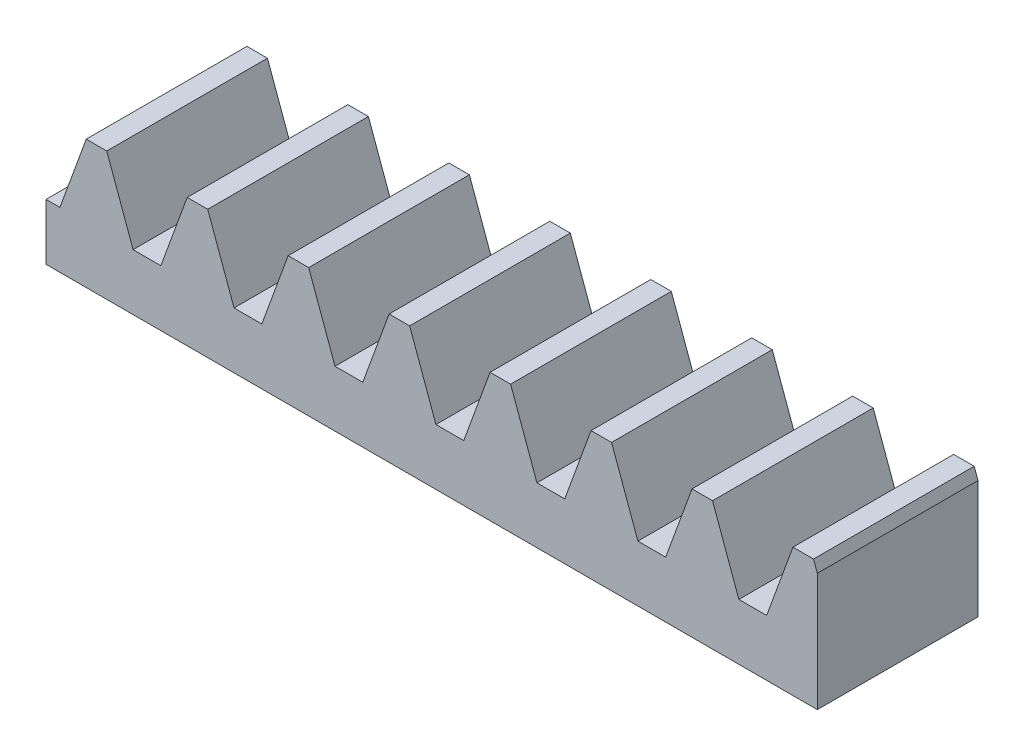
ISO-10303-21;
HEADER;
FILE_DESCRIPTION(('STEP AP214'),'2;1');
FILE_NAME('part.step','',(''),(''),'','','');
FILE_SCHEMA(('AUTOMOTIVE_DESIGN { 1 0 10303 214 1 1 1 1 }'));
ENDSEC;
DATA;
#1=APPLICATION_CONTEXT('core data for automotive mechanical design processes');
#2=APPLICATION_PROTOCOL_DEFINITION('international standard','automotive_design',2000,#1);
#3=PRODUCT_CONTEXT('',#1,'mechanical');
#4=PRODUCT('Part','Part','',(#3));
#5=PRODUCT_RELATED_PRODUCT_CATEGORY('part','',(#4));
#6=PRODUCT_DEFINITION_FORMATION('','',#4);
#7=PRODUCT_DEFINITION_CONTEXT('part definition',#1,'design');
#8=PRODUCT_DEFINITION('design','',#6,#7);
#9=PRODUCT_DEFINITION_SHAPE('','',#8);
#10=(LENGTH_UNIT() NAMED_UNIT(*) SI_UNIT(.MILLI.,.METRE.));
#11=(NAMED_UNIT(*) PLANE_ANGLE_UNIT() SI_UNIT($,.RADIAN.));
#12=(NAMED_UNIT(*) SI_UNIT($,.STERADIAN.) SOLID_ANGLE_UNIT());
#13=UNCERTAINTY_MEASURE_WITH_UNIT(LENGTH_MEASURE(1.E-05),#10,'distance_accuracy_value','');
#14=(GEOMETRIC_REPRESENTATION_CONTEXT(3) GLOBAL_UNCERTAINTY_ASSIGNED_CONTEXT((#13)) GLOBAL_UNIT_ASSIGNED_CONTEXT((#10,
#11,#12)) REPRESENTATION_CONTEXT('',''));
#15=CARTESIAN_POINT('',(0.,0.,0.));
#16=DIRECTION('',(0.,0.,1.));
#17=DIRECTION('',(1.,0.,0.));
#18=AXIS2_PLACEMENT_3D('',#15,#16,#17);
#19=CARTESIAN_POINT('',(0.,50.8,-63.5));
#20=DIRECTION('',(0.,1.,0.));
#21=DIRECTION('',(-1.,0.,0.));
#22=AXIS2_PLACEMENT_3D('',#19,#20,#21);
#23=PLANE('',#22);
#24=DIRECTION('',(0.,0.,1.));
#25=VECTOR('',#24,1.);
#26=CARTESIAN_POINT('',(263.395207946069,50.8,-63.5));
#27=LINE('',#26,#25);
#28=CARTESIAN_POINT('',(263.395207946069,50.8,-63.5));
#29=VERTEX_POINT('',#28);
#30=CARTESIAN_POINT('',(263.395207946069,50.8,0.));
#31=VERTEX_POINT('',#30);
#32=EDGE_CURVE('E325',#29,#31,#27,.T.);
#33=ORIENTED_EDGE('',*,*,#32,.F.);
#34=DIRECTION('',(-1.,0.,0.));
#35=VECTOR('',#34,1.);
#36=CARTESIAN_POINT('',(0.,50.8,-63.5));
#37=LINE('',#36,#35);
#38=CARTESIAN_POINT('',(255.281738568931,50.8,-63.5));
#39=VERTEX_POINT('',#38);
#40=EDGE_CURVE('E399',#29,#39,#37,.T.);
#41=ORIENTED_EDGE('',*,*,#40,.T.);
#42=DIRECTION('',(0.,0.,-1.));
#43=VECTOR('',#42,1.);
#44=CARTESIAN_POINT('',(255.281738568931,50.8,-63.5));
#45=LINE('',#44,#43);
#46=CARTESIAN_POINT('',(255.281738568931,50.8,0.));
#47=VERTEX_POINT('',#46);
#48=EDGE_CURVE('E328',#47,#39,#45,.T.);
#49=ORIENTED_EDGE('',*,*,#48,.F.);
#50=DIRECTION('',(-1.,0.,0.));
#51=VECTOR('',#50,1.);
#52=CARTESIAN_POINT('',(0.,50.8,0.));
#53=LINE('',#52,#51);
#54=EDGE_CURVE('E287',#31,#47,#53,.T.);
#55=ORIENTED_EDGE('',*,*,#54,.F.);
#56=EDGE_LOOP('',(#33,#41,#49,#55));
#57=FACE_BOUND('',#56,.T.);
#58=ADVANCED_FACE('F33',(#57),#23,.T.);
#59=DIRECTION('',(0.,0.,1.));
#60=VECTOR('',#59,1.);
#61=CARTESIAN_POINT('',(223.496981291069,50.8,-63.5));
#62=LINE('',#61,#60);
#63=CARTESIAN_POINT('',(223.496981291069,50.8,-63.5));
#64=VERTEX_POINT('',#63);
#65=CARTESIAN_POINT('',(223.496981291069,50.8,0.));
#66=VERTEX_POINT('',#65);
#67=EDGE_CURVE('E454',#64,#66,#62,.T.);
#68=ORIENTED_EDGE('',*,*,#67,.F.);
#69=CARTESIAN_POINT('',(215.383511913931,50.8,-63.5));
#70=VERTEX_POINT('',#69);
#71=EDGE_CURVE('E624',#64,#70,#37,.T.);
#72=ORIENTED_EDGE('',*,*,#71,.T.);
#73=DIRECTION('',(0.,0.,-1.));
#74=VECTOR('',#73,1.);
#75=CARTESIAN_POINT('',(215.383511913931,50.8,-63.5));
#76=LINE('',#75,#74);
#77=CARTESIAN_POINT('',(215.383511913931,50.8,0.));
#78=VERTEX_POINT('',#77);
#79=EDGE_CURVE('E473',#78,#70,#76,.T.);
#80=ORIENTED_EDGE('',*,*,#79,.F.);
#81=EDGE_CURVE('E329',#66,#78,#53,.T.);
#82=ORIENTED_EDGE('',*,*,#81,.F.);
#83=EDGE_LOOP('',(#68,#72,#80,#82));
#84=FACE_BOUND('',#83,.T.);
#85=ADVANCED_FACE('F582',(#84),#23,.T.);
#86=DIRECTION('',(0.,0.,1.));
#87=VECTOR('',#86,1.);
#88=CARTESIAN_POINT('',(183.598754636069,50.8,-63.5));
#89=LINE('',#88,#87);
#90=CARTESIAN_POINT('',(183.598754636069,50.8,-63.5));
#91=VERTEX_POINT('',#90);
#92=CARTESIAN_POINT('',(183.598754636069,50.8,0.));
#93=VERTEX_POINT('',#92);
#94=EDGE_CURVE('E477',#91,#93,#89,.T.);
#95=ORIENTED_EDGE('',*,*,#94,.F.);
#96=CARTESIAN_POINT('',(175.485285258931,50.8,-63.5));
#97=VERTEX_POINT('',#96);
#98=EDGE_CURVE('E620',#91,#97,#37,.T.);
#99=ORIENTED_EDGE('',*,*,#98,.T.);
#100=DIRECTION('',(0.,0.,-1.));
#101=VECTOR('',#100,1.);
#102=CARTESIAN_POINT('',(175.485285258931,50.8,-63.5));
#103=LINE('',#102,#101);
#104=CARTESIAN_POINT('',(175.485285258931,50.8,0.));
#105=VERTEX_POINT('',#104);
#106=EDGE_CURVE('E496',#105,#97,#103,.T.);
#107=ORIENTED_EDGE('',*,*,#106,.F.);
#108=EDGE_CURVE('E330',#93,#105,#53,.T.);
#109=ORIENTED_EDGE('',*,*,#108,.F.);
#110=EDGE_LOOP('',(#95,#99,#107,#109));
#111=FACE_BOUND('',#110,.T.);
#112=ADVANCED_FACE('F588',(#111),#23,.T.);
#113=DIRECTION('',(0.,0.,1.));
#114=VECTOR('',#113,1.);
#115=CARTESIAN_POINT('',(143.700527981069,50.8,-63.5));
#116=LINE('',#115,#114);
#117=CARTESIAN_POINT('',(143.700527981069,50.8,-63.5));
#118=VERTEX_POINT('',#117);
#119=CARTESIAN_POINT('',(143.700527981069,50.8,0.));
#120=VERTEX_POINT('',#119);
#121=EDGE_CURVE('E500',#118,#120,#116,.T.);
#122=ORIENTED_EDGE('',*,*,#121,.F.);
#123=CARTESIAN_POINT('',(135.587058603931,50.8,-63.5));
#124=VERTEX_POINT('',#123);
#125=EDGE_CURVE('E619',#118,#124,#37,.T.);
#126=ORIENTED_EDGE('',*,*,#125,.T.);
#127=DIRECTION('',(0.,0.,-1.));
#128=VECTOR('',#127,1.);
#129=CARTESIAN_POINT('',(135.587058603931,50.8,-63.5));
#130=LINE('',#129,#128);
#131=CARTESIAN_POINT('',(135.587058603931,50.8,0.));
#132=VERTEX_POINT('',#131);
#133=EDGE_CURVE('E519',#132,#124,#130,.T.);
#134=ORIENTED_EDGE('',*,*,#133,.F.);
#135=EDGE_CURVE('E334',#120,#132,#53,.T.);
#136=ORIENTED_EDGE('',*,*,#135,.F.);
#137=EDGE_LOOP('',(#122,#126,#134,#136));
#138=FACE_BOUND('',#137,.T.);
#139=ADVANCED_FACE('F606',(#138),#23,.T.);
#140=DIRECTION('',(0.,0.,1.));
#141=VECTOR('',#140,1.);
#142=CARTESIAN_POINT('',(103.802301326069,50.8,-63.5));
#143=LINE('',#142,#141);
#144=CARTESIAN_POINT('',(103.802301326069,50.8,-63.5));
#145=VERTEX_POINT('',#144);
#146=CARTESIAN_POINT('',(103.802301326069,50.8,0.));
#147=VERTEX_POINT('',#146);
#148=EDGE_CURVE('E523',#145,#147,#143,.T.);
#149=ORIENTED_EDGE('',*,*,#148,.F.);
#150=CARTESIAN_POINT('',(95.6888319489307,50.8,-63.5));
#151=VERTEX_POINT('',#150);
#152=EDGE_CURVE('E615',#145,#151,#37,.T.);
#153=ORIENTED_EDGE('',*,*,#152,.T.);
#154=DIRECTION('',(0.,0.,-1.));
#155=VECTOR('',#154,1.);
#156=CARTESIAN_POINT('',(95.6888319489307,50.8,-63.5));
#157=LINE('',#156,#155);
#158=CARTESIAN_POINT('',(95.6888319489307,50.8,0.));
#159=VERTEX_POINT('',#158);
#160=EDGE_CURVE('E542',#159,#151,#157,.T.);
#161=ORIENTED_EDGE('',*,*,#160,.F.);
#162=EDGE_CURVE('E338',#147,#159,#53,.T.);
#163=ORIENTED_EDGE('',*,*,#162,.F.);
#164=EDGE_LOOP('',(#149,#153,#161,#163));
#165=FACE_BOUND('',#164,.T.);
#166=ADVANCED_FACE('F602',(#165),#23,.T.);
#167=DIRECTION('',(0.,0.,1.));
#168=VECTOR('',#167,1.);
#169=CARTESIAN_POINT('',(63.9040746710693,50.8,-63.5));
#170=LINE('',#169,#168);
#171=CARTESIAN_POINT('',(63.9040746710693,50.8,-63.5));
#172=VERTEX_POINT('',#171);
#173=CARTESIAN_POINT('',(63.9040746710693,50.8,0.));
#174=VERTEX_POINT('',#173);
#175=EDGE_CURVE('E546',#172,#174,#170,.T.);
#176=ORIENTED_EDGE('',*,*,#175,.F.);
#177=CARTESIAN_POINT('',(55.7906052939307,50.8,-63.5));
#178=VERTEX_POINT('',#177);
#179=EDGE_CURVE('E368',#172,#178,#37,.T.);
#180=ORIENTED_EDGE('',*,*,#179,.T.);
#181=DIRECTION('',(0.,0.,-1.));
#182=VECTOR('',#181,1.);
#183=CARTESIAN_POINT('',(55.7906052939307,50.8,-63.5));
#184=LINE('',#183,#182);
#185=CARTESIAN_POINT('',(55.7906052939307,50.8,0.));
#186=VERTEX_POINT('',#185);
#187=EDGE_CURVE('E359',#186,#178,#184,.T.);
#188=ORIENTED_EDGE('',*,*,#187,.F.);
#189=EDGE_CURVE('E279',#174,#186,#53,.T.);
#190=ORIENTED_EDGE('',*,*,#189,.F.);
#191=EDGE_LOOP('',(#176,#180,#188,#190));
#192=FACE_BOUND('',#191,.T.);
#193=ADVANCED_FACE('F366',(#192),#23,.T.);
#194=DIRECTION('',(0.,0.,1.));
#195=VECTOR('',#194,1.);
#196=CARTESIAN_POINT('',(24.0058480160693,50.8,-63.5));
#197=LINE('',#196,#195);
#198=CARTESIAN_POINT('',(24.0058480160693,50.8,-63.5));
#199=VERTEX_POINT('',#198);
#200=CARTESIAN_POINT('',(24.0058480160693,50.8,0.));
#201=VERTEX_POINT('',#200);
#202=EDGE_CURVE('E369',#199,#201,#197,.T.);
#203=ORIENTED_EDGE('',*,*,#202,.F.);
#204=CARTESIAN_POINT('',(15.8923786389307,50.8,-63.5));
#205=VERTEX_POINT('',#204);
#206=EDGE_CURVE('E398',#199,#205,#37,.T.);
#207=ORIENTED_EDGE('',*,*,#206,.T.);
#208=DIRECTION('',(0.,0.,-1.));
#209=VECTOR('',#208,1.);
#210=CARTESIAN_POINT('',(15.8923786389307,50.8,-63.5));
#211=LINE('',#210,#209);
#212=CARTESIAN_POINT('',(15.8923786389307,50.8,0.));
#213=VERTEX_POINT('',#212);
#214=EDGE_CURVE('E390',#213,#205,#211,.T.);
#215=ORIENTED_EDGE('',*,*,#214,.F.);
#216=EDGE_CURVE('E277',#201,#213,#53,.T.);
#217=ORIENTED_EDGE('',*,*,#216,.F.);
#218=EDGE_LOOP('',(#203,#207,#215,#217));
#219=FACE_BOUND('',#218,.T.);
#220=ADVANCED_FACE('F564',(#219),#23,.T.);
#221=CARTESIAN_POINT('',(0.,0.,-63.5));
#222=DIRECTION('',(-1.,0.,0.));
#223=DIRECTION('',(0.,0.,1.));
#224=AXIS2_PLACEMENT_3D('',#221,#222,#223);
#225=PLANE('',#224);
#226=DIRECTION('',(0.,0.,1.));
#227=VECTOR('',#226,1.);
#228=CARTESIAN_POINT('',(0.,22.225,-63.5));
#229=LINE('',#228,#227);
#230=CARTESIAN_POINT('',(0.,22.225,-63.5));
#231=VERTEX_POINT('',#230);
#232=CARTESIAN_POINT('',(0.,22.225,0.));
#233=VERTEX_POINT('',#232);
#234=EDGE_CURVE('E388',#231,#233,#229,.T.);
#235=ORIENTED_EDGE('',*,*,#234,.F.);
#236=DIRECTION('',(0.,-1.,0.));
#237=VECTOR('',#236,1.);
#238=CARTESIAN_POINT('',(0.,0.,-63.5));
#239=LINE('',#238,#237);
#240=CARTESIAN_POINT('',(0.,0.,-63.5));
#241=VERTEX_POINT('',#240);
#242=EDGE_CURVE('E286',#231,#241,#239,.T.);
#243=ORIENTED_EDGE('',*,*,#242,.T.);
#244=DIRECTION('',(0.,0.,1.));
#245=VECTOR('',#244,1.);
#246=CARTESIAN_POINT('',(0.,0.,-63.5));
#247=LINE('',#246,#245);
#248=CARTESIAN_POINT('',(0.,0.,0.));
#249=VERTEX_POINT('',#248);
#250=EDGE_CURVE('E291',#241,#249,#247,.T.);
#251=ORIENTED_EDGE('',*,*,#250,.T.);
#252=DIRECTION('',(0.,-1.,0.));
#253=VECTOR('',#252,1.);
#254=CARTESIAN_POINT('',(0.,0.,0.));
#255=LINE('',#254,#253);
#256=EDGE_CURVE('E282',#233,#249,#255,.T.);
#257=ORIENTED_EDGE('',*,*,#256,.F.);
#258=EDGE_LOOP('',(#235,#243,#251,#257));
#259=FACE_BOUND('',#258,.T.);
#260=ADVANCED_FACE('F35',(#259),#225,.T.);
#261=DIRECTION('',(0.,0.,1.));
#262=VECTOR('',#261,1.);
#263=CARTESIAN_POINT('',(303.293434601069,50.8,-63.5));
#264=LINE('',#263,#262);
#265=CARTESIAN_POINT('',(303.293434601069,50.8,-63.5));
#266=VERTEX_POINT('',#265);
#267=CARTESIAN_POINT('',(303.293434601069,50.8,0.));
#268=VERTEX_POINT('',#267);
#269=EDGE_CURVE('E48',#266,#268,#264,.T.);
#270=ORIENTED_EDGE('',*,*,#269,.F.);
#271=CARTESIAN_POINT('',(295.179965223931,50.8,-63.5));
#272=VERTEX_POINT('',#271);
#273=EDGE_CURVE('E294',#266,#272,#37,.T.);
#274=ORIENTED_EDGE('',*,*,#273,.T.);
#275=DIRECTION('',(0.,0.,-1.));
#276=VECTOR('',#275,1.);
#277=CARTESIAN_POINT('',(295.179965223931,50.8,-63.5));
#278=LINE('',#277,#276);
#279=CARTESIAN_POINT('',(295.179965223931,50.8,0.));
#280=VERTEX_POINT('',#279);
#281=EDGE_CURVE('E430',#280,#272,#278,.T.);
#282=ORIENTED_EDGE('',*,*,#281,.F.);
#283=EDGE_CURVE('E281',#268,#280,#53,.T.);
#284=ORIENTED_EDGE('',*,*,#283,.F.);
#285=EDGE_LOOP('',(#270,#274,#282,#284));
#286=FACE_BOUND('',#285,.T.);
#287=ADVANCED_FACE('F584',(#286),#23,.T.);
#288=CARTESIAN_POINT('',(304.8,0.,-63.5));
#289=DIRECTION('',(1.,0.,0.));
#290=DIRECTION('',(0.,0.,-1.));
#291=AXIS2_PLACEMENT_3D('',#288,#289,#290);
#292=PLANE('',#291);
#293=DIRECTION('',(0.,0.,-1.));
#294=VECTOR('',#293,1.);
#295=CARTESIAN_POINT('',(304.8,46.6607455855063,-63.5));
#296=LINE('',#295,#294);
#297=CARTESIAN_POINT('',(304.8,46.6607455855065,0.));
#298=VERTEX_POINT('',#297);
#299=CARTESIAN_POINT('',(304.8,46.6607455855065,-63.5));
#300=VERTEX_POINT('',#299);
#301=EDGE_CURVE('E259',#298,#300,#296,.T.);
#302=ORIENTED_EDGE('',*,*,#301,.F.);
#303=DIRECTION('',(0.,1.,0.));
#304=VECTOR('',#303,1.);
#305=CARTESIAN_POINT('',(304.8,0.,0.));
#306=LINE('',#305,#304);
#307=CARTESIAN_POINT('',(304.8,0.,0.));
#308=VERTEX_POINT('',#307);
#309=EDGE_CURVE('E268',#308,#298,#306,.T.);
#310=ORIENTED_EDGE('',*,*,#309,.F.);
#311=DIRECTION('',(0.,0.,1.));
#312=VECTOR('',#311,1.);
#313=CARTESIAN_POINT('',(304.8,0.,-63.5));
#314=LINE('',#313,#312);
#315=CARTESIAN_POINT('',(304.8,0.,-63.5));
#316=VERTEX_POINT('',#315);
#317=EDGE_CURVE('E288',#316,#308,#314,.T.);
#318=ORIENTED_EDGE('',*,*,#317,.F.);
#319=DIRECTION('',(0.,1.,0.));
#320=VECTOR('',#319,1.);
#321=CARTESIAN_POINT('',(304.8,0.,-63.5));
#322=LINE('',#321,#320);
#323=EDGE_CURVE('E271',#316,#300,#322,.T.);
#324=ORIENTED_EDGE('',*,*,#323,.T.);
#325=EDGE_LOOP('',(#302,#310,#318,#324));
#326=FACE_BOUND('',#325,.T.);
#327=ADVANCED_FACE('F267',(#326),#292,.T.);
#328=CARTESIAN_POINT('',(0.,0.,-63.5));
#329=DIRECTION('',(0.,-1.,0.));
#330=DIRECTION('',(0.,0.,-1.));
#331=AXIS2_PLACEMENT_3D('',#328,#329,#330);
#332=PLANE('',#331);
#333=DIRECTION('',(1.,0.,0.));
#334=VECTOR('',#333,1.);
#335=CARTESIAN_POINT('',(0.,0.,0.));
#336=LINE('',#335,#334);
#337=EDGE_CURVE('E276',#249,#308,#336,.T.);
#338=ORIENTED_EDGE('',*,*,#337,.F.);
#339=ORIENTED_EDGE('',*,*,#250,.F.);
#340=DIRECTION('',(1.,0.,0.));
#341=VECTOR('',#340,1.);
#342=CARTESIAN_POINT('',(0.,0.,-63.5));
#343=LINE('',#342,#341);
#344=EDGE_CURVE('E394',#241,#316,#343,.T.);
#345=ORIENTED_EDGE('',*,*,#344,.T.);
#346=ORIENTED_EDGE('',*,*,#317,.T.);
#347=EDGE_LOOP('',(#338,#339,#345,#346));
#348=FACE_BOUND('',#347,.T.);
#349=ADVANCED_FACE('F408',(#348),#332,.T.);
#350=CARTESIAN_POINT('',(0.,0.,-63.5));
#351=DIRECTION('',(0.,0.,-1.));
#352=DIRECTION('',(-1.,0.,0.));
#353=AXIS2_PLACEMENT_3D('',#350,#351,#352);
#354=PLANE('',#353);
#355=DIRECTION('',(0.342020143325663,-0.939692620785911,0.));
#356=VECTOR('',#355,1.);
#357=CARTESIAN_POINT('',(303.284189757119,50.8254,-63.5));
#358=LINE('',#357,#356);
#359=EDGE_CURVE('E272',#266,#300,#358,.T.);
#360=ORIENTED_EDGE('',*,*,#359,.T.);
#361=ORIENTED_EDGE('',*,*,#323,.F.);
#362=ORIENTED_EDGE('',*,*,#344,.F.);
#363=ORIENTED_EDGE('',*,*,#242,.F.);
#364=DIRECTION('',(1.,0.,0.));
#365=VECTOR('',#364,1.);
#366=CARTESIAN_POINT('',(5.49192919477418,22.225,-63.5));
#367=LINE('',#366,#365);
#368=CARTESIAN_POINT('',(5.49192919477418,22.225,-63.5));
#369=VERTEX_POINT('',#368);
#370=EDGE_CURVE('E377',#231,#369,#367,.T.);
#371=ORIENTED_EDGE('',*,*,#370,.T.);
#372=DIRECTION('',(0.342020143325663,0.939692620785911,0.));
#373=VECTOR('',#372,1.);
#374=CARTESIAN_POINT('',(15.9016234828811,50.8254,-63.5));
#375=LINE('',#374,#373);
#376=EDGE_CURVE('E380',#369,#205,#375,.T.);
#377=ORIENTED_EDGE('',*,*,#376,.T.);
#378=ORIENTED_EDGE('',*,*,#206,.F.);
#379=DIRECTION('',(0.342020143325663,-0.939692620785911,0.));
#380=VECTOR('',#379,1.);
#381=CARTESIAN_POINT('',(23.9966031721189,50.8254,-63.5));
#382=LINE('',#381,#380);
#383=CARTESIAN_POINT('',(34.4062974602258,22.225,-63.5));
#384=VERTEX_POINT('',#383);
#385=EDGE_CURVE('E363',#199,#384,#382,.T.);
#386=ORIENTED_EDGE('',*,*,#385,.T.);
#387=DIRECTION('',(1.,0.,0.));
#388=VECTOR('',#387,1.);
#389=CARTESIAN_POINT('',(45.3901558497742,22.225,-63.5));
#390=LINE('',#389,#388);
#391=CARTESIAN_POINT('',(45.3901558497742,22.225,-63.5));
#392=VERTEX_POINT('',#391);
#393=EDGE_CURVE('E550',#384,#392,#390,.T.);
#394=ORIENTED_EDGE('',*,*,#393,.T.);
#395=DIRECTION('',(0.342020143325663,0.939692620785911,0.));
#396=VECTOR('',#395,1.);
#397=CARTESIAN_POINT('',(55.7998501378811,50.8254,-63.5));
#398=LINE('',#397,#396);
#399=EDGE_CURVE('E553',#392,#178,#398,.T.);
#400=ORIENTED_EDGE('',*,*,#399,.T.);
#401=ORIENTED_EDGE('',*,*,#179,.F.);
#402=DIRECTION('',(0.342020143325663,-0.939692620785911,0.));
#403=VECTOR('',#402,1.);
#404=CARTESIAN_POINT('',(63.8948298271189,50.8254,-63.5));
#405=LINE('',#404,#403);
#406=CARTESIAN_POINT('',(74.3045241152258,22.225,-63.5));
#407=VERTEX_POINT('',#406);
#408=EDGE_CURVE('E526',#172,#407,#405,.T.);
#409=ORIENTED_EDGE('',*,*,#408,.T.);
#410=DIRECTION('',(1.,0.,0.));
#411=VECTOR('',#410,1.);
#412=CARTESIAN_POINT('',(85.2883825047742,22.225,-63.5));
#413=LINE('',#412,#411);
#414=CARTESIAN_POINT('',(85.2883825047742,22.225,-63.5));
#415=VERTEX_POINT('',#414);
#416=EDGE_CURVE('E529',#407,#415,#413,.T.);
#417=ORIENTED_EDGE('',*,*,#416,.T.);
#418=DIRECTION('',(0.342020143325663,0.939692620785911,0.));
#419=VECTOR('',#418,1.);
#420=CARTESIAN_POINT('',(95.6980767928811,50.8254,-63.5));
#421=LINE('',#420,#419);
#422=EDGE_CURVE('E533',#415,#151,#421,.T.);
#423=ORIENTED_EDGE('',*,*,#422,.T.);
#424=ORIENTED_EDGE('',*,*,#152,.F.);
#425=DIRECTION('',(0.342020143325663,-0.939692620785911,0.));
#426=VECTOR('',#425,1.);
#427=CARTESIAN_POINT('',(103.793056482119,50.8254,-63.5));
#428=LINE('',#427,#426);
#429=CARTESIAN_POINT('',(114.202750770226,22.225,-63.5));
#430=VERTEX_POINT('',#429);
#431=EDGE_CURVE('E503',#145,#430,#428,.T.);
#432=ORIENTED_EDGE('',*,*,#431,.T.);
#433=DIRECTION('',(1.,0.,0.));
#434=VECTOR('',#433,1.);
#435=CARTESIAN_POINT('',(125.186609159774,22.225,-63.5));
#436=LINE('',#435,#434);
#437=CARTESIAN_POINT('',(125.186609159774,22.225,-63.5));
#438=VERTEX_POINT('',#437);
#439=EDGE_CURVE('E506',#430,#438,#436,.T.);
#440=ORIENTED_EDGE('',*,*,#439,.T.);
#441=DIRECTION('',(0.342020143325663,0.939692620785911,0.));
#442=VECTOR('',#441,1.);
#443=CARTESIAN_POINT('',(135.596303447881,50.8254,-63.5));
#444=LINE('',#443,#442);
#445=EDGE_CURVE('E510',#438,#124,#444,.T.);
#446=ORIENTED_EDGE('',*,*,#445,.T.);
#447=ORIENTED_EDGE('',*,*,#125,.F.);
#448=DIRECTION('',(0.342020143325663,-0.939692620785911,0.));
#449=VECTOR('',#448,1.);
#450=CARTESIAN_POINT('',(143.691283137119,50.8254,-63.5));
#451=LINE('',#450,#449);
#452=CARTESIAN_POINT('',(154.100977425226,22.225,-63.5));
#453=VERTEX_POINT('',#452);
#454=EDGE_CURVE('E480',#118,#453,#451,.T.);
#455=ORIENTED_EDGE('',*,*,#454,.T.);
#456=DIRECTION('',(1.,0.,0.));
#457=VECTOR('',#456,1.);
#458=CARTESIAN_POINT('',(165.084835814774,22.225,-63.5));
#459=LINE('',#458,#457);
#460=CARTESIAN_POINT('',(165.084835814774,22.225,-63.5));
#461=VERTEX_POINT('',#460);
#462=EDGE_CURVE('E483',#453,#461,#459,.T.);
#463=ORIENTED_EDGE('',*,*,#462,.T.);
#464=DIRECTION('',(0.342020143325663,0.939692620785911,0.));
#465=VECTOR('',#464,1.);
#466=CARTESIAN_POINT('',(175.494530102881,50.8254,-63.5));
#467=LINE('',#466,#465);
#468=EDGE_CURVE('E487',#461,#97,#467,.T.);
#469=ORIENTED_EDGE('',*,*,#468,.T.);
#470=ORIENTED_EDGE('',*,*,#98,.F.);
#471=DIRECTION('',(0.342020143325663,-0.939692620785911,0.));
#472=VECTOR('',#471,1.);
#473=CARTESIAN_POINT('',(183.589509792119,50.8254,-63.5));
#474=LINE('',#473,#472);
#475=CARTESIAN_POINT('',(193.999204080226,22.225,-63.5));
#476=VERTEX_POINT('',#475);
#477=EDGE_CURVE('E457',#91,#476,#474,.T.);
#478=ORIENTED_EDGE('',*,*,#477,.T.);
#479=DIRECTION('',(1.,0.,0.));
#480=VECTOR('',#479,1.);
#481=CARTESIAN_POINT('',(204.983062469774,22.225,-63.5));
#482=LINE('',#481,#480);
#483=CARTESIAN_POINT('',(204.983062469774,22.225,-63.5));
#484=VERTEX_POINT('',#483);
#485=EDGE_CURVE('E460',#476,#484,#482,.T.);
#486=ORIENTED_EDGE('',*,*,#485,.T.);
#487=DIRECTION('',(0.342020143325663,0.939692620785911,0.));
#488=VECTOR('',#487,1.);
#489=CARTESIAN_POINT('',(215.392756757881,50.8254,-63.5));
#490=LINE('',#489,#488);
#491=EDGE_CURVE('E464',#484,#70,#490,.T.);
#492=ORIENTED_EDGE('',*,*,#491,.T.);
#493=ORIENTED_EDGE('',*,*,#71,.F.);
#494=DIRECTION('',(0.342020143325663,-0.939692620785911,0.));
#495=VECTOR('',#494,1.);
#496=CARTESIAN_POINT('',(223.487736447119,50.8254,-63.5));
#497=LINE('',#496,#495);
#498=CARTESIAN_POINT('',(233.897430735226,22.225,-63.5));
#499=VERTEX_POINT('',#498);
#500=EDGE_CURVE('E436',#64,#499,#497,.T.);
#501=ORIENTED_EDGE('',*,*,#500,.T.);
#502=DIRECTION('',(1.,0.,0.));
#503=VECTOR('',#502,1.);
#504=CARTESIAN_POINT('',(244.881289124774,22.225,-63.5));
#505=LINE('',#504,#503);
#506=CARTESIAN_POINT('',(244.881289124774,22.225,-63.5));
#507=VERTEX_POINT('',#506);
#508=EDGE_CURVE('E439',#499,#507,#505,.T.);
#509=ORIENTED_EDGE('',*,*,#508,.T.);
#510=DIRECTION('',(0.342020143325663,0.939692620785911,0.));
#511=VECTOR('',#510,1.);
#512=CARTESIAN_POINT('',(255.290983412881,50.8254,-63.5));
#513=LINE('',#512,#511);
#514=EDGE_CURVE('E443',#507,#39,#513,.T.);
#515=ORIENTED_EDGE('',*,*,#514,.T.);
#516=ORIENTED_EDGE('',*,*,#40,.F.);
#517=DIRECTION('',(0.342020143325663,-0.939692620785911,0.));
#518=VECTOR('',#517,1.);
#519=CARTESIAN_POINT('',(263.385963102119,50.8254,-63.5));
#520=LINE('',#519,#518);
#521=CARTESIAN_POINT('',(273.795657390226,22.225,-63.5));
#522=VERTEX_POINT('',#521);
#523=EDGE_CURVE('E416',#29,#522,#520,.T.);
#524=ORIENTED_EDGE('',*,*,#523,.T.);
#525=DIRECTION('',(1.,0.,0.));
#526=VECTOR('',#525,1.);
#527=CARTESIAN_POINT('',(284.779515779774,22.225,-63.5));
#528=LINE('',#527,#526);
#529=CARTESIAN_POINT('',(284.779515779774,22.225,-63.5));
#530=VERTEX_POINT('',#529);
#531=EDGE_CURVE('E419',#522,#530,#528,.T.);
#532=ORIENTED_EDGE('',*,*,#531,.T.);
#533=DIRECTION('',(0.342020143325663,0.939692620785911,0.));
#534=VECTOR('',#533,1.);
#535=CARTESIAN_POINT('',(295.189210067881,50.8254,-63.5));
#536=LINE('',#535,#534);
#537=EDGE_CURVE('E423',#530,#272,#536,.T.);
#538=ORIENTED_EDGE('',*,*,#537,.T.);
#539=ORIENTED_EDGE('',*,*,#273,.F.);
#540=EDGE_LOOP('',(#360,#361,#362,#363,#371,#377,#378,#386,#394,#400,#401,#409,#417,#423,#424,
#432,#440,#446,#447,#455,#463,#469,#470,#478,#486,#492,#493,#501,#509,#515,#516,#524,#532,#538,#539));
#541=FACE_BOUND('',#540,.T.);
#542=ADVANCED_FACE('F410',(#541),#354,.T.);
#543=CARTESIAN_POINT('',(0.,0.,0.));
#544=DIRECTION('',(0.,0.,-1.));
#545=DIRECTION('',(-1.,0.,0.));
#546=AXIS2_PLACEMENT_3D('',#543,#544,#545);
#547=PLANE('',#546);
#548=ORIENTED_EDGE('',*,*,#309,.T.);
#549=DIRECTION('',(-0.342020143325663,0.939692620785911,0.));
#550=VECTOR('',#549,1.);
#551=CARTESIAN_POINT('',(284.141647691883,103.419102075197,0.));
#552=LINE('',#551,#550);
#553=EDGE_CURVE('E11',#298,#268,#552,.T.);
#554=ORIENTED_EDGE('',*,*,#553,.T.);
#555=ORIENTED_EDGE('',*,*,#283,.T.);
#556=DIRECTION('',(0.342020143325663,0.939692620785911,0.));
#557=VECTOR('',#556,1.);
#558=CARTESIAN_POINT('',(295.189210067881,50.8254,0.));
#559=LINE('',#558,#557);
#560=CARTESIAN_POINT('',(284.779515779774,22.225,0.));
#561=VERTEX_POINT('',#560);
#562=EDGE_CURVE('E420',#561,#280,#559,.T.);
#563=ORIENTED_EDGE('',*,*,#562,.F.);
#564=DIRECTION('',(1.,0.,0.));
#565=VECTOR('',#564,1.);
#566=CARTESIAN_POINT('',(284.779515779774,22.225,0.));
#567=LINE('',#566,#565);
#568=CARTESIAN_POINT('',(273.795657390226,22.225,0.));
#569=VERTEX_POINT('',#568);
#570=EDGE_CURVE('E320',#569,#561,#567,.T.);
#571=ORIENTED_EDGE('',*,*,#570,.F.);
#572=DIRECTION('',(-0.342020143325663,0.939692620785911,0.));
#573=VECTOR('',#572,1.);
#574=CARTESIAN_POINT('',(248.910626954701,90.5960592040479,0.));
#575=LINE('',#574,#573);
#576=EDGE_CURVE('E41',#569,#31,#575,.T.);
#577=ORIENTED_EDGE('',*,*,#576,.T.);
#578=ORIENTED_EDGE('',*,*,#54,.T.);
#579=DIRECTION('',(0.342020143325663,0.939692620785911,0.));
#580=VECTOR('',#579,1.);
#581=CARTESIAN_POINT('',(255.290983412881,50.8254,0.));
#582=LINE('',#581,#580);
#583=CARTESIAN_POINT('',(244.881289124774,22.225,0.));
#584=VERTEX_POINT('',#583);
#585=EDGE_CURVE('E440',#584,#47,#582,.T.);
#586=ORIENTED_EDGE('',*,*,#585,.F.);
#587=DIRECTION('',(1.,0.,0.));
#588=VECTOR('',#587,1.);
#589=CARTESIAN_POINT('',(244.881289124774,22.225,0.));
#590=LINE('',#589,#588);
#591=CARTESIAN_POINT('',(233.897430735226,22.225,0.));
#592=VERTEX_POINT('',#591);
#593=EDGE_CURVE('E435',#592,#584,#590,.T.);
#594=ORIENTED_EDGE('',*,*,#593,.F.);
#595=DIRECTION('',(-0.342020143325663,0.939692620785911,0.));
#596=VECTOR('',#595,1.);
#597=CARTESIAN_POINT('',(213.679606217518,77.7730163328985,0.));
#598=LINE('',#597,#596);
#599=EDGE_CURVE('E312',#592,#66,#598,.T.);
#600=ORIENTED_EDGE('',*,*,#599,.T.);
#601=ORIENTED_EDGE('',*,*,#81,.T.);
#602=DIRECTION('',(0.342020143325663,0.939692620785911,0.));
#603=VECTOR('',#602,1.);
#604=CARTESIAN_POINT('',(215.392756757881,50.8254,0.));
#605=LINE('',#604,#603);
#606=CARTESIAN_POINT('',(204.983062469774,22.225,0.));
#607=VERTEX_POINT('',#606);
#608=EDGE_CURVE('E461',#607,#78,#605,.T.);
#609=ORIENTED_EDGE('',*,*,#608,.F.);
#610=DIRECTION('',(1.,0.,0.));
#611=VECTOR('',#610,1.);
#612=CARTESIAN_POINT('',(204.983062469774,22.225,0.));
#613=LINE('',#612,#611);
#614=CARTESIAN_POINT('',(193.999204080226,22.225,0.));
#615=VERTEX_POINT('',#614);
#616=EDGE_CURVE('E456',#615,#607,#613,.T.);
#617=ORIENTED_EDGE('',*,*,#616,.F.);
#618=DIRECTION('',(-0.342020143325663,0.939692620785911,0.));
#619=VECTOR('',#618,1.);
#620=CARTESIAN_POINT('',(178.448585480336,64.9499734617491,0.));
#621=LINE('',#620,#619);
#622=EDGE_CURVE('E309',#615,#93,#621,.T.);
#623=ORIENTED_EDGE('',*,*,#622,.T.);
#624=ORIENTED_EDGE('',*,*,#108,.T.);
#625=DIRECTION('',(0.342020143325663,0.939692620785911,0.));
#626=VECTOR('',#625,1.);
#627=CARTESIAN_POINT('',(175.494530102881,50.8254,0.));
#628=LINE('',#627,#626);
#629=CARTESIAN_POINT('',(165.084835814774,22.225,0.));
#630=VERTEX_POINT('',#629);
#631=EDGE_CURVE('E484',#630,#105,#628,.T.);
#632=ORIENTED_EDGE('',*,*,#631,.F.);
#633=DIRECTION('',(1.,0.,0.));
#634=VECTOR('',#633,1.);
#635=CARTESIAN_POINT('',(165.084835814774,22.225,0.));
#636=LINE('',#635,#634);
#637=CARTESIAN_POINT('',(154.100977425226,22.225,0.));
#638=VERTEX_POINT('',#637);
#639=EDGE_CURVE('E479',#638,#630,#636,.T.);
#640=ORIENTED_EDGE('',*,*,#639,.F.);
#641=DIRECTION('',(-0.342020143325663,0.939692620785911,0.));
#642=VECTOR('',#641,1.);
#643=CARTESIAN_POINT('',(143.217564743154,52.1269305905997,0.));
#644=LINE('',#643,#642);
#645=EDGE_CURVE('E306',#638,#120,#644,.T.);
#646=ORIENTED_EDGE('',*,*,#645,.T.);
#647=ORIENTED_EDGE('',*,*,#135,.T.);
#648=DIRECTION('',(0.342020143325663,0.939692620785911,0.));
#649=VECTOR('',#648,1.);
#650=CARTESIAN_POINT('',(135.596303447881,50.8254,0.));
#651=LINE('',#650,#649);
#652=CARTESIAN_POINT('',(125.186609159774,22.225,0.));
#653=VERTEX_POINT('',#652);
#654=EDGE_CURVE('E507',#653,#132,#651,.T.);
#655=ORIENTED_EDGE('',*,*,#654,.F.);
#656=DIRECTION('',(1.,0.,0.));
#657=VECTOR('',#656,1.);
#658=CARTESIAN_POINT('',(125.186609159774,22.225,0.));
#659=LINE('',#658,#657);
#660=CARTESIAN_POINT('',(114.202750770226,22.225,0.));
#661=VERTEX_POINT('',#660);
#662=EDGE_CURVE('E502',#661,#653,#659,.T.);
#663=ORIENTED_EDGE('',*,*,#662,.F.);
#664=DIRECTION('',(-0.342020143325663,0.939692620785911,0.));
#665=VECTOR('',#664,1.);
#666=CARTESIAN_POINT('',(107.986544005971,39.3038877194502,0.));
#667=LINE('',#666,#665);
#668=EDGE_CURVE('E303',#661,#147,#667,.T.);
#669=ORIENTED_EDGE('',*,*,#668,.T.);
#670=ORIENTED_EDGE('',*,*,#162,.T.);
#671=DIRECTION('',(0.342020143325663,0.939692620785911,0.));
#672=VECTOR('',#671,1.);
#673=CARTESIAN_POINT('',(95.6980767928811,50.8254,0.));
#674=LINE('',#673,#672);
#675=CARTESIAN_POINT('',(85.2883825047742,22.225,0.));
#676=VERTEX_POINT('',#675);
#677=EDGE_CURVE('E530',#676,#159,#674,.T.);
#678=ORIENTED_EDGE('',*,*,#677,.F.);
#679=DIRECTION('',(1.,0.,0.));
#680=VECTOR('',#679,1.);
#681=CARTESIAN_POINT('',(85.2883825047742,22.225,0.));
#682=LINE('',#681,#680);
#683=CARTESIAN_POINT('',(74.3045241152258,22.225,0.));
#684=VERTEX_POINT('',#683);
#685=EDGE_CURVE('E525',#684,#676,#682,.T.);
#686=ORIENTED_EDGE('',*,*,#685,.F.);
#687=DIRECTION('',(-0.342020143325663,0.939692620785911,0.));
#688=VECTOR('',#687,1.);
#689=CARTESIAN_POINT('',(72.7555232687892,26.4808448483008,0.));
#690=LINE('',#689,#688);
#691=EDGE_CURVE('E300',#684,#174,#690,.T.);
#692=ORIENTED_EDGE('',*,*,#691,.T.);
#693=ORIENTED_EDGE('',*,*,#189,.T.);
#694=DIRECTION('',(0.342020143325663,0.939692620785911,0.));
#695=VECTOR('',#694,1.);
#696=CARTESIAN_POINT('',(55.7998501378811,50.8254,0.));
#697=LINE('',#696,#695);
#698=CARTESIAN_POINT('',(45.3901558497742,22.225,0.));
#699=VERTEX_POINT('',#698);
#700=EDGE_CURVE('E349',#699,#186,#697,.T.);
#701=ORIENTED_EDGE('',*,*,#700,.F.);
#702=DIRECTION('',(1.,0.,0.));
#703=VECTOR('',#702,1.);
#704=CARTESIAN_POINT('',(45.3901558497742,22.225,0.));
#705=LINE('',#704,#703);
#706=CARTESIAN_POINT('',(34.4062974602258,22.225,0.));
#707=VERTEX_POINT('',#706);
#708=EDGE_CURVE('E364',#707,#699,#705,.T.);
#709=ORIENTED_EDGE('',*,*,#708,.F.);
#710=DIRECTION('',(-0.342020143325663,0.939692620785911,0.));
#711=VECTOR('',#710,1.);
#712=CARTESIAN_POINT('',(37.5245025316069,13.6578019771514,0.));
#713=LINE('',#712,#711);
#714=EDGE_CURVE('E297',#707,#201,#713,.T.);
#715=ORIENTED_EDGE('',*,*,#714,.T.);
#716=ORIENTED_EDGE('',*,*,#216,.T.);
#717=DIRECTION('',(0.342020143325663,0.939692620785911,0.));
#718=VECTOR('',#717,1.);
#719=CARTESIAN_POINT('',(15.9016234828811,50.8254,0.));
#720=LINE('',#719,#718);
#721=CARTESIAN_POINT('',(5.49192919477418,22.225,0.));
#722=VERTEX_POINT('',#721);
#723=EDGE_CURVE('E371',#722,#213,#720,.T.);
#724=ORIENTED_EDGE('',*,*,#723,.F.);
#725=DIRECTION('',(-1.,0.,0.));
#726=VECTOR('',#725,1.);
#727=CARTESIAN_POINT('',(0.,22.225,0.));
#728=LINE('',#727,#726);
#729=EDGE_CURVE('E290',#722,#233,#728,.T.);
#730=ORIENTED_EDGE('',*,*,#729,.T.);
#731=ORIENTED_EDGE('',*,*,#256,.T.);
#732=ORIENTED_EDGE('',*,*,#337,.T.);
#733=EDGE_LOOP('',(#548,#554,#555,#563,#571,#577,#578,#586,#594,#600,#601,#609,#617,#623,#624,
#632,#640,#646,#647,#655,#663,#669,#670,#678,#686,#692,#693,#701,#709,#715,#716,#724,#730,#731,#732));
#734=FACE_BOUND('',#733,.T.);
#735=ADVANCED_FACE('F274',(#734),#547,.F.);
#736=CARTESIAN_POINT('',(15.9016234828811,50.8254,-63.5));
#737=DIRECTION('',(0.939692620785911,-0.342020143325663,0.));
#738=DIRECTION('',(0.342020143325663,0.939692620785911,0.));
#739=AXIS2_PLACEMENT_3D('',#736,#737,#738);
#740=PLANE('',#739);
#741=ORIENTED_EDGE('',*,*,#214,.T.);
#742=ORIENTED_EDGE('',*,*,#376,.F.);
#743=DIRECTION('',(0.,0.,1.));
#744=VECTOR('',#743,1.);
#745=CARTESIAN_POINT('',(5.49192919477418,22.225,-63.5));
#746=LINE('',#745,#744);
#747=EDGE_CURVE('E383',#369,#722,#746,.T.);
#748=ORIENTED_EDGE('',*,*,#747,.T.);
#749=ORIENTED_EDGE('',*,*,#723,.T.);
#750=EDGE_LOOP('',(#741,#742,#748,#749));
#751=FACE_BOUND('',#750,.T.);
#752=ADVANCED_FACE('F568',(#751),#740,.F.);
#753=CARTESIAN_POINT('',(5.49192919477418,22.225,-63.5));
#754=DIRECTION('',(0.,-1.,0.));
#755=DIRECTION('',(0.,0.,-1.));
#756=AXIS2_PLACEMENT_3D('',#753,#754,#755);
#757=PLANE('',#756);
#758=ORIENTED_EDGE('',*,*,#234,.T.);
#759=ORIENTED_EDGE('',*,*,#729,.F.);
#760=ORIENTED_EDGE('',*,*,#747,.F.);
#761=ORIENTED_EDGE('',*,*,#370,.F.);
#762=EDGE_LOOP('',(#758,#759,#760,#761));
#763=FACE_BOUND('',#762,.T.);
#764=ADVANCED_FACE('F570',(#763),#757,.F.);
#765=CARTESIAN_POINT('',(23.9966031721189,50.8254,-63.5));
#766=DIRECTION('',(-0.939692620785911,-0.342020143325663,0.));
#767=DIRECTION('',(0.342020143325663,-0.939692620785911,0.));
#768=AXIS2_PLACEMENT_3D('',#765,#766,#767);
#769=PLANE('',#768);
#770=ORIENTED_EDGE('',*,*,#202,.T.);
#771=ORIENTED_EDGE('',*,*,#714,.F.);
#772=DIRECTION('',(0.,0.,1.));
#773=VECTOR('',#772,1.);
#774=CARTESIAN_POINT('',(34.4062974602258,22.225,-63.5));
#775=LINE('',#774,#773);
#776=EDGE_CURVE('E373',#384,#707,#775,.T.);
#777=ORIENTED_EDGE('',*,*,#776,.F.);
#778=ORIENTED_EDGE('',*,*,#385,.F.);
#779=EDGE_LOOP('',(#770,#771,#777,#778));
#780=FACE_BOUND('',#779,.T.);
#781=ADVANCED_FACE('F572',(#780),#769,.F.);
#782=CARTESIAN_POINT('',(55.7998501378811,50.8254,-63.5));
#783=DIRECTION('',(0.939692620785911,-0.342020143325663,0.));
#784=DIRECTION('',(0.342020143325663,0.939692620785911,0.));
#785=AXIS2_PLACEMENT_3D('',#782,#783,#784);
#786=PLANE('',#785);
#787=ORIENTED_EDGE('',*,*,#187,.T.);
#788=ORIENTED_EDGE('',*,*,#399,.F.);
#789=DIRECTION('',(0.,0.,1.));
#790=VECTOR('',#789,1.);
#791=CARTESIAN_POINT('',(45.3901558497742,22.225,-63.5));
#792=LINE('',#791,#790);
#793=EDGE_CURVE('E361',#392,#699,#792,.T.);
#794=ORIENTED_EDGE('',*,*,#793,.T.);
#795=ORIENTED_EDGE('',*,*,#700,.T.);
#796=EDGE_LOOP('',(#787,#788,#794,#795));
#797=FACE_BOUND('',#796,.T.);
#798=ADVANCED_FACE('F357',(#797),#786,.F.);
#799=CARTESIAN_POINT('',(45.3901558497742,22.225,-63.5));
#800=DIRECTION('',(0.,-1.,0.));
#801=DIRECTION('',(0.,0.,-1.));
#802=AXIS2_PLACEMENT_3D('',#799,#800,#801);
#803=PLANE('',#802);
#804=ORIENTED_EDGE('',*,*,#708,.T.);
#805=ORIENTED_EDGE('',*,*,#793,.F.);
#806=ORIENTED_EDGE('',*,*,#393,.F.);
#807=ORIENTED_EDGE('',*,*,#776,.T.);
#808=EDGE_LOOP('',(#804,#805,#806,#807));
#809=FACE_BOUND('',#808,.T.);
#810=ADVANCED_FACE('F556',(#809),#803,.F.);
#811=CARTESIAN_POINT('',(63.8948298271189,50.8254,-63.5));
#812=DIRECTION('',(-0.939692620785911,-0.342020143325663,0.));
#813=DIRECTION('',(0.342020143325663,-0.939692620785911,0.));
#814=AXIS2_PLACEMENT_3D('',#811,#812,#813);
#815=PLANE('',#814);
#816=ORIENTED_EDGE('',*,*,#175,.T.);
#817=ORIENTED_EDGE('',*,*,#691,.F.);
#818=DIRECTION('',(0.,0.,1.));
#819=VECTOR('',#818,1.);
#820=CARTESIAN_POINT('',(74.3045241152258,22.225,-63.5));
#821=LINE('',#820,#819);
#822=EDGE_CURVE('E536',#407,#684,#821,.T.);
#823=ORIENTED_EDGE('',*,*,#822,.F.);
#824=ORIENTED_EDGE('',*,*,#408,.F.);
#825=EDGE_LOOP('',(#816,#817,#823,#824));
#826=FACE_BOUND('',#825,.T.);
#827=ADVANCED_FACE('F681',(#826),#815,.F.);
#828=CARTESIAN_POINT('',(95.6980767928811,50.8254,-63.5));
#829=DIRECTION('',(0.939692620785911,-0.342020143325663,0.));
#830=DIRECTION('',(0.342020143325663,0.939692620785911,0.));
#831=AXIS2_PLACEMENT_3D('',#828,#829,#830);
#832=PLANE('',#831);
#833=ORIENTED_EDGE('',*,*,#160,.T.);
#834=ORIENTED_EDGE('',*,*,#422,.F.);
#835=DIRECTION('',(0.,0.,1.));
#836=VECTOR('',#835,1.);
#837=CARTESIAN_POINT('',(85.2883825047742,22.225,-63.5));
#838=LINE('',#837,#836);
#839=EDGE_CURVE('E540',#415,#676,#838,.T.);
#840=ORIENTED_EDGE('',*,*,#839,.T.);
#841=ORIENTED_EDGE('',*,*,#677,.T.);
#842=EDGE_LOOP('',(#833,#834,#840,#841));
#843=FACE_BOUND('',#842,.T.);
#844=ADVANCED_FACE('F675',(#843),#832,.F.);
#845=CARTESIAN_POINT('',(85.2883825047742,22.225,-63.5));
#846=DIRECTION('',(0.,-1.,0.));
#847=DIRECTION('',(0.,0.,-1.));
#848=AXIS2_PLACEMENT_3D('',#845,#846,#847);
#849=PLANE('',#848);
#850=ORIENTED_EDGE('',*,*,#685,.T.);
#851=ORIENTED_EDGE('',*,*,#839,.F.);
#852=ORIENTED_EDGE('',*,*,#416,.F.);
#853=ORIENTED_EDGE('',*,*,#822,.T.);
#854=EDGE_LOOP('',(#850,#851,#852,#853));
#855=FACE_BOUND('',#854,.T.);
#856=ADVANCED_FACE('F668',(#855),#849,.F.);
#857=CARTESIAN_POINT('',(103.793056482119,50.8254,-63.5));
#858=DIRECTION('',(-0.939692620785911,-0.342020143325663,0.));
#859=DIRECTION('',(0.342020143325663,-0.939692620785911,0.));
#860=AXIS2_PLACEMENT_3D('',#857,#858,#859);
#861=PLANE('',#860);
#862=ORIENTED_EDGE('',*,*,#148,.T.);
#863=ORIENTED_EDGE('',*,*,#668,.F.);
#864=DIRECTION('',(0.,0.,1.));
#865=VECTOR('',#864,1.);
#866=CARTESIAN_POINT('',(114.202750770226,22.225,-63.5));
#867=LINE('',#866,#865);
#868=EDGE_CURVE('E513',#430,#661,#867,.T.);
#869=ORIENTED_EDGE('',*,*,#868,.F.);
#870=ORIENTED_EDGE('',*,*,#431,.F.);
#871=EDGE_LOOP('',(#862,#863,#869,#870));
#872=FACE_BOUND('',#871,.T.);
#873=ADVANCED_FACE('F666',(#872),#861,.F.);
#874=CARTESIAN_POINT('',(135.596303447881,50.8254,-63.5));
#875=DIRECTION('',(0.939692620785911,-0.342020143325663,0.));
#876=DIRECTION('',(0.342020143325663,0.939692620785911,0.));
#877=AXIS2_PLACEMENT_3D('',#874,#875,#876);
#878=PLANE('',#877);
#879=ORIENTED_EDGE('',*,*,#133,.T.);
#880=ORIENTED_EDGE('',*,*,#445,.F.);
#881=DIRECTION('',(0.,0.,1.));
#882=VECTOR('',#881,1.);
#883=CARTESIAN_POINT('',(125.186609159774,22.225,-63.5));
#884=LINE('',#883,#882);
#885=EDGE_CURVE('E517',#438,#653,#884,.T.);
#886=ORIENTED_EDGE('',*,*,#885,.T.);
#887=ORIENTED_EDGE('',*,*,#654,.T.);
#888=EDGE_LOOP('',(#879,#880,#886,#887));
#889=FACE_BOUND('',#888,.T.);
#890=ADVANCED_FACE('F661',(#889),#878,.F.);
#891=CARTESIAN_POINT('',(125.186609159774,22.225,-63.5));
#892=DIRECTION('',(0.,-1.,0.));
#893=DIRECTION('',(0.,0.,-1.));
#894=AXIS2_PLACEMENT_3D('',#891,#892,#893);
#895=PLANE('',#894);
#896=ORIENTED_EDGE('',*,*,#662,.T.);
#897=ORIENTED_EDGE('',*,*,#885,.F.);
#898=ORIENTED_EDGE('',*,*,#439,.F.);
#899=ORIENTED_EDGE('',*,*,#868,.T.);
#900=EDGE_LOOP('',(#896,#897,#898,#899));
#901=FACE_BOUND('',#900,.T.);
#902=ADVANCED_FACE('F664',(#901),#895,.F.);
#903=CARTESIAN_POINT('',(143.691283137119,50.8254,-63.5));
#904=DIRECTION('',(-0.939692620785911,-0.342020143325663,0.));
#905=DIRECTION('',(0.342020143325663,-0.939692620785911,0.));
#906=AXIS2_PLACEMENT_3D('',#903,#904,#905);
#907=PLANE('',#906);
#908=ORIENTED_EDGE('',*,*,#121,.T.);
#909=ORIENTED_EDGE('',*,*,#645,.F.);
#910=DIRECTION('',(0.,0.,1.));
#911=VECTOR('',#910,1.);
#912=CARTESIAN_POINT('',(154.100977425226,22.225,-63.5));
#913=LINE('',#912,#911);
#914=EDGE_CURVE('E490',#453,#638,#913,.T.);
#915=ORIENTED_EDGE('',*,*,#914,.F.);
#916=ORIENTED_EDGE('',*,*,#454,.F.);
#917=EDGE_LOOP('',(#908,#909,#915,#916));
#918=FACE_BOUND('',#917,.T.);
#919=ADVANCED_FACE('F725',(#918),#907,.F.);
#920=CARTESIAN_POINT('',(175.494530102881,50.8254,-63.5));
#921=DIRECTION('',(0.939692620785911,-0.342020143325663,0.));
#922=DIRECTION('',(0.342020143325663,0.939692620785911,0.));
#923=AXIS2_PLACEMENT_3D('',#920,#921,#922);
#924=PLANE('',#923);
#925=ORIENTED_EDGE('',*,*,#106,.T.);
#926=ORIENTED_EDGE('',*,*,#468,.F.);
#927=DIRECTION('',(0.,0.,1.));
#928=VECTOR('',#927,1.);
#929=CARTESIAN_POINT('',(165.084835814774,22.225,-63.5));
#930=LINE('',#929,#928);
#931=EDGE_CURVE('E494',#461,#630,#930,.T.);
#932=ORIENTED_EDGE('',*,*,#931,.T.);
#933=ORIENTED_EDGE('',*,*,#631,.T.);
#934=EDGE_LOOP('',(#925,#926,#932,#933));
#935=FACE_BOUND('',#934,.T.);
#936=ADVANCED_FACE('F652',(#935),#924,.F.);
#937=CARTESIAN_POINT('',(165.084835814774,22.225,-63.5));
#938=DIRECTION('',(0.,-1.,0.));
#939=DIRECTION('',(0.,0.,-1.));
#940=AXIS2_PLACEMENT_3D('',#937,#938,#939);
#941=PLANE('',#940);
#942=ORIENTED_EDGE('',*,*,#639,.T.);
#943=ORIENTED_EDGE('',*,*,#931,.F.);
#944=ORIENTED_EDGE('',*,*,#462,.F.);
#945=ORIENTED_EDGE('',*,*,#914,.T.);
#946=EDGE_LOOP('',(#942,#943,#944,#945));
#947=FACE_BOUND('',#946,.T.);
#948=ADVANCED_FACE('F655',(#947),#941,.F.);
#949=CARTESIAN_POINT('',(183.589509792119,50.8254,-63.5));
#950=DIRECTION('',(-0.939692620785911,-0.342020143325663,0.));
#951=DIRECTION('',(0.342020143325663,-0.939692620785911,0.));
#952=AXIS2_PLACEMENT_3D('',#949,#950,#951);
#953=PLANE('',#952);
#954=ORIENTED_EDGE('',*,*,#94,.T.);
#955=ORIENTED_EDGE('',*,*,#622,.F.);
#956=DIRECTION('',(0.,0.,1.));
#957=VECTOR('',#956,1.);
#958=CARTESIAN_POINT('',(193.999204080226,22.225,-63.5));
#959=LINE('',#958,#957);
#960=EDGE_CURVE('E467',#476,#615,#959,.T.);
#961=ORIENTED_EDGE('',*,*,#960,.F.);
#962=ORIENTED_EDGE('',*,*,#477,.F.);
#963=EDGE_LOOP('',(#954,#955,#961,#962));
#964=FACE_BOUND('',#963,.T.);
#965=ADVANCED_FACE('F749',(#964),#953,.F.);
#966=CARTESIAN_POINT('',(215.392756757881,50.8254,-63.5));
#967=DIRECTION('',(0.939692620785911,-0.342020143325663,0.));
#968=DIRECTION('',(0.342020143325663,0.939692620785911,0.));
#969=AXIS2_PLACEMENT_3D('',#966,#967,#968);
#970=PLANE('',#969);
#971=ORIENTED_EDGE('',*,*,#79,.T.);
#972=ORIENTED_EDGE('',*,*,#491,.F.);
#973=DIRECTION('',(0.,0.,1.));
#974=VECTOR('',#973,1.);
#975=CARTESIAN_POINT('',(204.983062469774,22.225,-63.5));
#976=LINE('',#975,#974);
#977=EDGE_CURVE('E471',#484,#607,#976,.T.);
#978=ORIENTED_EDGE('',*,*,#977,.T.);
#979=ORIENTED_EDGE('',*,*,#608,.T.);
#980=EDGE_LOOP('',(#971,#972,#978,#979));
#981=FACE_BOUND('',#980,.T.);
#982=ADVANCED_FACE('F643',(#981),#970,.F.);
#983=CARTESIAN_POINT('',(204.983062469774,22.225,-63.5));
#984=DIRECTION('',(0.,-1.,0.));
#985=DIRECTION('',(0.,0.,-1.));
#986=AXIS2_PLACEMENT_3D('',#983,#984,#985);
#987=PLANE('',#986);
#988=ORIENTED_EDGE('',*,*,#616,.T.);
#989=ORIENTED_EDGE('',*,*,#977,.F.);
#990=ORIENTED_EDGE('',*,*,#485,.F.);
#991=ORIENTED_EDGE('',*,*,#960,.T.);
#992=EDGE_LOOP('',(#988,#989,#990,#991));
#993=FACE_BOUND('',#992,.T.);
#994=ADVANCED_FACE('F646',(#993),#987,.F.);
#995=CARTESIAN_POINT('',(223.487736447119,50.8254,-63.5));
#996=DIRECTION('',(-0.939692620785911,-0.342020143325663,0.));
#997=DIRECTION('',(0.342020143325663,-0.939692620785911,0.));
#998=AXIS2_PLACEMENT_3D('',#995,#996,#997);
#999=PLANE('',#998);
#1000=ORIENTED_EDGE('',*,*,#67,.T.);
#1001=ORIENTED_EDGE('',*,*,#599,.F.);
#1002=DIRECTION('',(0.,0.,1.));
#1003=VECTOR('',#1002,1.);
#1004=CARTESIAN_POINT('',(233.897430735226,22.225,-63.5));
#1005=LINE('',#1004,#1003);
#1006=EDGE_CURVE('E446',#499,#592,#1005,.T.);
#1007=ORIENTED_EDGE('',*,*,#1006,.F.);
#1008=ORIENTED_EDGE('',*,*,#500,.F.);
#1009=EDGE_LOOP('',(#1000,#1001,#1007,#1008));
#1010=FACE_BOUND('',#1009,.T.);
#1011=ADVANCED_FACE('F774',(#1010),#999,.F.);
#1012=CARTESIAN_POINT('',(255.290983412881,50.8254,-63.5));
#1013=DIRECTION('',(0.939692620785911,-0.342020143325663,0.));
#1014=DIRECTION('',(0.342020143325663,0.939692620785911,0.));
#1015=AXIS2_PLACEMENT_3D('',#1012,#1013,#1014);
#1016=PLANE('',#1015);
#1017=ORIENTED_EDGE('',*,*,#48,.T.);
#1018=ORIENTED_EDGE('',*,*,#514,.F.);
#1019=DIRECTION('',(0.,0.,1.));
#1020=VECTOR('',#1019,1.);
#1021=CARTESIAN_POINT('',(244.881289124774,22.225,-63.5));
#1022=LINE('',#1021,#1020);
#1023=EDGE_CURVE('E450',#507,#584,#1022,.T.);
#1024=ORIENTED_EDGE('',*,*,#1023,.T.);
#1025=ORIENTED_EDGE('',*,*,#585,.T.);
#1026=EDGE_LOOP('',(#1017,#1018,#1024,#1025));
#1027=FACE_BOUND('',#1026,.T.);
#1028=ADVANCED_FACE('F634',(#1027),#1016,.F.);
#1029=CARTESIAN_POINT('',(244.881289124774,22.225,-63.5));
#1030=DIRECTION('',(0.,-1.,0.));
#1031=DIRECTION('',(0.,0.,-1.));
#1032=AXIS2_PLACEMENT_3D('',#1029,#1030,#1031);
#1033=PLANE('',#1032);
#1034=ORIENTED_EDGE('',*,*,#593,.T.);
#1035=ORIENTED_EDGE('',*,*,#1023,.F.);
#1036=ORIENTED_EDGE('',*,*,#508,.F.);
#1037=ORIENTED_EDGE('',*,*,#1006,.T.);
#1038=EDGE_LOOP('',(#1034,#1035,#1036,#1037));
#1039=FACE_BOUND('',#1038,.T.);
#1040=ADVANCED_FACE('F637',(#1039),#1033,.F.);
#1041=CARTESIAN_POINT('',(263.385963102119,50.8254,-63.5));
#1042=DIRECTION('',(-0.939692620785911,-0.342020143325663,0.));
#1043=DIRECTION('',(0.342020143325663,-0.939692620785911,0.));
#1044=AXIS2_PLACEMENT_3D('',#1041,#1042,#1043);
#1045=PLANE('',#1044);
#1046=ORIENTED_EDGE('',*,*,#32,.T.);
#1047=ORIENTED_EDGE('',*,*,#576,.F.);
#1048=DIRECTION('',(0.,0.,1.));
#1049=VECTOR('',#1048,1.);
#1050=CARTESIAN_POINT('',(273.795657390226,22.225,-63.5));
#1051=LINE('',#1050,#1049);
#1052=EDGE_CURVE('E55',#522,#569,#1051,.T.);
#1053=ORIENTED_EDGE('',*,*,#1052,.F.);
#1054=ORIENTED_EDGE('',*,*,#523,.F.);
#1055=EDGE_LOOP('',(#1046,#1047,#1053,#1054));
#1056=FACE_BOUND('',#1055,.T.);
#1057=ADVANCED_FACE('F799',(#1056),#1045,.F.);
#1058=CARTESIAN_POINT('',(295.189210067881,50.8254,-63.5));
#1059=DIRECTION('',(0.939692620785911,-0.342020143325663,0.));
#1060=DIRECTION('',(0.342020143325663,0.939692620785911,0.));
#1061=AXIS2_PLACEMENT_3D('',#1058,#1059,#1060);
#1062=PLANE('',#1061);
#1063=ORIENTED_EDGE('',*,*,#281,.T.);
#1064=ORIENTED_EDGE('',*,*,#537,.F.);
#1065=DIRECTION('',(0.,0.,1.));
#1066=VECTOR('',#1065,1.);
#1067=CARTESIAN_POINT('',(284.779515779774,22.225,-63.5));
#1068=LINE('',#1067,#1066);
#1069=EDGE_CURVE('E428',#530,#561,#1068,.T.);
#1070=ORIENTED_EDGE('',*,*,#1069,.T.);
#1071=ORIENTED_EDGE('',*,*,#562,.T.);
#1072=EDGE_LOOP('',(#1063,#1064,#1070,#1071));
#1073=FACE_BOUND('',#1072,.T.);
#1074=ADVANCED_FACE('F808',(#1073),#1062,.F.);
#1075=CARTESIAN_POINT('',(284.779515779774,22.225,-63.5));
#1076=DIRECTION('',(0.,-1.,0.));
#1077=DIRECTION('',(0.,0.,-1.));
#1078=AXIS2_PLACEMENT_3D('',#1075,#1076,#1077);
#1079=PLANE('',#1078);
#1080=ORIENTED_EDGE('',*,*,#570,.T.);
#1081=ORIENTED_EDGE('',*,*,#1069,.F.);
#1082=ORIENTED_EDGE('',*,*,#531,.F.);
#1083=ORIENTED_EDGE('',*,*,#1052,.T.);
#1084=EDGE_LOOP('',(#1080,#1081,#1082,#1083));
#1085=FACE_BOUND('',#1084,.T.);
#1086=ADVANCED_FACE('F817',(#1085),#1079,.F.);
#1087=CARTESIAN_POINT('',(303.284189757119,50.8254,-63.5));
#1088=DIRECTION('',(-0.939692620785911,-0.342020143325663,0.));
#1089=DIRECTION('',(0.342020143325663,-0.939692620785911,0.));
#1090=AXIS2_PLACEMENT_3D('',#1087,#1088,#1089);
#1091=PLANE('',#1090);
#1092=ORIENTED_EDGE('',*,*,#269,.T.);
#1093=ORIENTED_EDGE('',*,*,#553,.F.);
#1094=ORIENTED_EDGE('',*,*,#301,.T.);
#1095=ORIENTED_EDGE('',*,*,#359,.F.);
#1096=EDGE_LOOP('',(#1092,#1093,#1094,#1095));
#1097=FACE_BOUND('',#1096,.T.);
#1098=ADVANCED_FACE('F258',(#1097),#1091,.F.);
#1099=CLOSED_SHELL('',(#58,#85,#112,#139,#166,#193,#220,#260,#287,#327,#349,#542,#735,#752,#764,
#781,#798,#810,#827,#844,#856,#873,#890,#902,#919,#936,#948,#965,#982,#994,#1011,#1028,#1040,
#1057,#1074,#1086,#1098));
#1100=MANIFOLD_SOLID_BREP('B2',#1099);
#1101=ADVANCED_BREP_SHAPE_REPRESENTATION('',(#18,#1100),#14);
#1102=SHAPE_DEFINITION_REPRESENTATION(#9,#1101);
ENDSEC;
END-ISO-10303-21;
